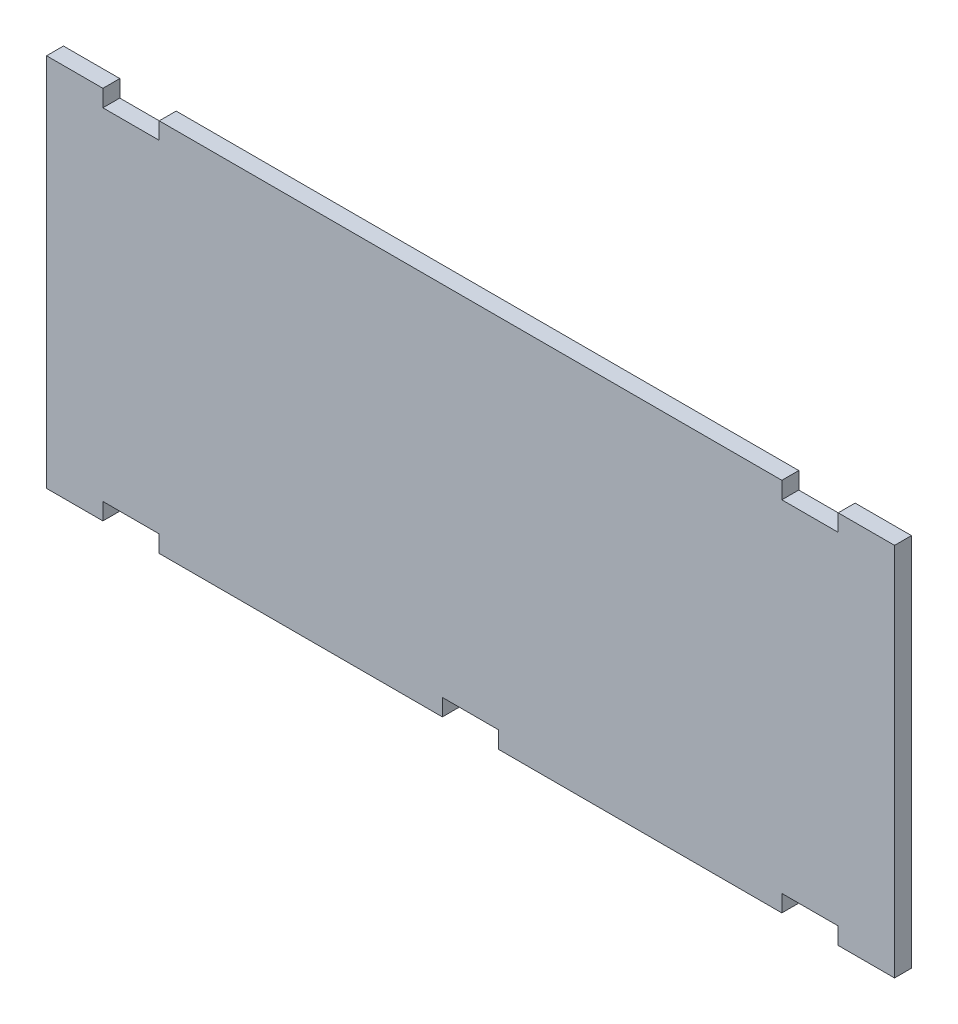
ISO-10303-21;
HEADER;
FILE_DESCRIPTION(('STEP AP214'),'2;1');
FILE_NAME('part.step','',(''),(''),'','','');
FILE_SCHEMA(('AUTOMOTIVE_DESIGN { 1 0 10303 214 1 1 1 1 }'));
ENDSEC;
DATA;
#1=APPLICATION_CONTEXT('core data for automotive mechanical design processes');
#2=APPLICATION_PROTOCOL_DEFINITION('international standard','automotive_design',2000,#1);
#3=PRODUCT_CONTEXT('',#1,'mechanical');
#4=PRODUCT('Part','Part','',(#3));
#5=PRODUCT_RELATED_PRODUCT_CATEGORY('part','',(#4));
#6=PRODUCT_DEFINITION_FORMATION('','',#4);
#7=PRODUCT_DEFINITION_CONTEXT('part definition',#1,'design');
#8=PRODUCT_DEFINITION('design','',#6,#7);
#9=PRODUCT_DEFINITION_SHAPE('','',#8);
#10=(LENGTH_UNIT() NAMED_UNIT(*) SI_UNIT(.MILLI.,.METRE.));
#11=(NAMED_UNIT(*) PLANE_ANGLE_UNIT() SI_UNIT($,.RADIAN.));
#12=(NAMED_UNIT(*) SI_UNIT($,.STERADIAN.) SOLID_ANGLE_UNIT());
#13=UNCERTAINTY_MEASURE_WITH_UNIT(LENGTH_MEASURE(1.E-05),#10,'distance_accuracy_value','');
#14=(GEOMETRIC_REPRESENTATION_CONTEXT(3) GLOBAL_UNCERTAINTY_ASSIGNED_CONTEXT((#13)) GLOBAL_UNIT_ASSIGNED_CONTEXT((#10,
#11,#12)) REPRESENTATION_CONTEXT('',''));
#15=CARTESIAN_POINT('',(0.,0.,0.));
#16=DIRECTION('',(0.,0.,1.));
#17=DIRECTION('',(1.,0.,0.));
#18=AXIS2_PLACEMENT_3D('',#15,#16,#17);
#19=CARTESIAN_POINT('',(0.,0.,6.));
#20=DIRECTION('',(0.,1.,0.));
#21=DIRECTION('',(0.,0.,1.));
#22=AXIS2_PLACEMENT_3D('',#19,#20,#21);
#23=PLANE('',#22);
#24=DIRECTION('',(1.,0.,0.));
#25=VECTOR('',#24,1.);
#26=CARTESIAN_POINT('',(0.,0.,0.));
#27=LINE('',#26,#25);
#28=CARTESIAN_POINT('',(-20.,0.,0.));
#29=VERTEX_POINT('',#28);
#30=CARTESIAN_POINT('',(0.,0.,0.));
#31=VERTEX_POINT('',#30);
#32=EDGE_CURVE('E225',#29,#31,#27,.T.);
#33=ORIENTED_EDGE('',*,*,#32,.T.);
#34=DIRECTION('',(0.,0.,-1.));
#35=VECTOR('',#34,1.);
#36=CARTESIAN_POINT('',(0.,0.,6.));
#37=LINE('',#36,#35);
#38=CARTESIAN_POINT('',(0.,0.,6.));
#39=VERTEX_POINT('',#38);
#40=EDGE_CURVE('E11',#39,#31,#37,.T.);
#41=ORIENTED_EDGE('',*,*,#40,.F.);
#42=DIRECTION('',(1.,0.,0.));
#43=VECTOR('',#42,1.);
#44=CARTESIAN_POINT('',(0.,0.,6.));
#45=LINE('',#44,#43);
#46=CARTESIAN_POINT('',(-20.,0.,6.));
#47=VERTEX_POINT('',#46);
#48=EDGE_CURVE('E271',#47,#39,#45,.T.);
#49=ORIENTED_EDGE('',*,*,#48,.F.);
#50=DIRECTION('',(0.,0.,-1.));
#51=VECTOR('',#50,1.);
#52=CARTESIAN_POINT('',(-20.,0.,6.));
#53=LINE('',#52,#51);
#54=EDGE_CURVE('E221',#47,#29,#53,.T.);
#55=ORIENTED_EDGE('',*,*,#54,.T.);
#56=EDGE_LOOP('',(#33,#41,#49,#55));
#57=FACE_BOUND('',#56,.T.);
#58=ADVANCED_FACE('F33',(#57),#23,.F.);
#59=CARTESIAN_POINT('',(0.,0.,6.));
#60=DIRECTION('',(-1.,0.,0.));
#61=DIRECTION('',(0.,0.,1.));
#62=AXIS2_PLACEMENT_3D('',#59,#60,#61);
#63=PLANE('',#62);
#64=DIRECTION('',(0.,1.,0.));
#65=VECTOR('',#64,1.);
#66=CARTESIAN_POINT('',(0.,0.,0.));
#67=LINE('',#66,#65);
#68=CARTESIAN_POINT('',(0.,133.,0.));
#69=VERTEX_POINT('',#68);
#70=EDGE_CURVE('E228',#31,#69,#67,.T.);
#71=ORIENTED_EDGE('',*,*,#70,.T.);
#72=DIRECTION('',(0.,0.,-1.));
#73=VECTOR('',#72,1.);
#74=CARTESIAN_POINT('',(0.,133.,6.));
#75=LINE('',#74,#73);
#76=CARTESIAN_POINT('',(0.,133.,6.));
#77=VERTEX_POINT('',#76);
#78=EDGE_CURVE('E41',#77,#69,#75,.T.);
#79=ORIENTED_EDGE('',*,*,#78,.F.);
#80=DIRECTION('',(0.,1.,0.));
#81=VECTOR('',#80,1.);
#82=CARTESIAN_POINT('',(0.,0.,6.));
#83=LINE('',#82,#81);
#84=EDGE_CURVE('E140',#39,#77,#83,.T.);
#85=ORIENTED_EDGE('',*,*,#84,.F.);
#86=ORIENTED_EDGE('',*,*,#40,.T.);
#87=EDGE_LOOP('',(#71,#79,#85,#86));
#88=FACE_BOUND('',#87,.T.);
#89=ADVANCED_FACE('F409',(#88),#63,.F.);
#90=CARTESIAN_POINT('',(0.,133.,6.));
#91=DIRECTION('',(0.,-1.,0.));
#92=DIRECTION('',(0.,0.,-1.));
#93=AXIS2_PLACEMENT_3D('',#90,#91,#92);
#94=PLANE('',#93);
#95=DIRECTION('',(-1.,0.,0.));
#96=VECTOR('',#95,1.);
#97=CARTESIAN_POINT('',(0.,133.,0.));
#98=LINE('',#97,#96);
#99=CARTESIAN_POINT('',(-20.,133.,0.));
#100=VERTEX_POINT('',#99);
#101=EDGE_CURVE('E230',#69,#100,#98,.T.);
#102=ORIENTED_EDGE('',*,*,#101,.T.);
#103=DIRECTION('',(0.,0.,-1.));
#104=VECTOR('',#103,1.);
#105=CARTESIAN_POINT('',(-20.,133.,6.));
#106=LINE('',#105,#104);
#107=CARTESIAN_POINT('',(-20.,133.,6.));
#108=VERTEX_POINT('',#107);
#109=EDGE_CURVE('E326',#108,#100,#106,.T.);
#110=ORIENTED_EDGE('',*,*,#109,.F.);
#111=DIRECTION('',(-1.,0.,0.));
#112=VECTOR('',#111,1.);
#113=CARTESIAN_POINT('',(0.,133.,6.));
#114=LINE('',#113,#112);
#115=EDGE_CURVE('E334',#77,#108,#114,.T.);
#116=ORIENTED_EDGE('',*,*,#115,.F.);
#117=ORIENTED_EDGE('',*,*,#78,.T.);
#118=EDGE_LOOP('',(#102,#110,#116,#117));
#119=FACE_BOUND('',#118,.T.);
#120=ADVANCED_FACE('F332',(#119),#94,.F.);
#121=CARTESIAN_POINT('',(-20.,133.,6.));
#122=DIRECTION('',(1.,0.,0.));
#123=DIRECTION('',(0.,0.,-1.));
#124=AXIS2_PLACEMENT_3D('',#121,#122,#123);
#125=PLANE('',#124);
#126=DIRECTION('',(0.,-1.,0.));
#127=VECTOR('',#126,1.);
#128=CARTESIAN_POINT('',(-20.,133.,0.));
#129=LINE('',#128,#127);
#130=CARTESIAN_POINT('',(-20.,127.,0.));
#131=VERTEX_POINT('',#130);
#132=EDGE_CURVE('E232',#100,#131,#129,.T.);
#133=ORIENTED_EDGE('',*,*,#132,.T.);
#134=DIRECTION('',(0.,0.,-1.));
#135=VECTOR('',#134,1.);
#136=CARTESIAN_POINT('',(-20.,127.,6.));
#137=LINE('',#136,#135);
#138=CARTESIAN_POINT('',(-20.,127.,6.));
#139=VERTEX_POINT('',#138);
#140=EDGE_CURVE('E323',#139,#131,#137,.T.);
#141=ORIENTED_EDGE('',*,*,#140,.F.);
#142=DIRECTION('',(0.,-1.,0.));
#143=VECTOR('',#142,1.);
#144=CARTESIAN_POINT('',(-20.,133.,6.));
#145=LINE('',#144,#143);
#146=EDGE_CURVE('E352',#108,#139,#145,.T.);
#147=ORIENTED_EDGE('',*,*,#146,.F.);
#148=ORIENTED_EDGE('',*,*,#109,.T.);
#149=EDGE_LOOP('',(#133,#141,#147,#148));
#150=FACE_BOUND('',#149,.T.);
#151=ADVANCED_FACE('F343',(#150),#125,.F.);
#152=CARTESIAN_POINT('',(-40.,127.,6.));
#153=DIRECTION('',(0.,-1.,0.));
#154=DIRECTION('',(0.,0.,-1.));
#155=AXIS2_PLACEMENT_3D('',#152,#153,#154);
#156=PLANE('',#155);
#157=DIRECTION('',(-1.,0.,0.));
#158=VECTOR('',#157,1.);
#159=CARTESIAN_POINT('',(-40.,127.,0.));
#160=LINE('',#159,#158);
#161=CARTESIAN_POINT('',(-40.,127.,0.));
#162=VERTEX_POINT('',#161);
#163=EDGE_CURVE('E234',#131,#162,#160,.T.);
#164=ORIENTED_EDGE('',*,*,#163,.T.);
#165=DIRECTION('',(0.,0.,-1.));
#166=VECTOR('',#165,1.);
#167=CARTESIAN_POINT('',(-40.,127.,6.));
#168=LINE('',#167,#166);
#169=CARTESIAN_POINT('',(-40.,127.,6.));
#170=VERTEX_POINT('',#169);
#171=EDGE_CURVE('E320',#170,#162,#168,.T.);
#172=ORIENTED_EDGE('',*,*,#171,.F.);
#173=DIRECTION('',(-1.,0.,0.));
#174=VECTOR('',#173,1.);
#175=CARTESIAN_POINT('',(-40.,127.,6.));
#176=LINE('',#175,#174);
#177=EDGE_CURVE('E349',#139,#170,#176,.T.);
#178=ORIENTED_EDGE('',*,*,#177,.F.);
#179=ORIENTED_EDGE('',*,*,#140,.T.);
#180=EDGE_LOOP('',(#164,#172,#178,#179));
#181=FACE_BOUND('',#180,.T.);
#182=ADVANCED_FACE('F347',(#181),#156,.F.);
#183=CARTESIAN_POINT('',(-40.,133.,6.));
#184=DIRECTION('',(-1.,0.,0.));
#185=DIRECTION('',(0.,-1.,0.));
#186=AXIS2_PLACEMENT_3D('',#183,#184,#185);
#187=PLANE('',#186);
#188=DIRECTION('',(0.,1.,0.));
#189=VECTOR('',#188,1.);
#190=CARTESIAN_POINT('',(-40.,133.,0.));
#191=LINE('',#190,#189);
#192=CARTESIAN_POINT('',(-40.,133.,0.));
#193=VERTEX_POINT('',#192);
#194=EDGE_CURVE('E236',#162,#193,#191,.T.);
#195=ORIENTED_EDGE('',*,*,#194,.T.);
#196=DIRECTION('',(0.,0.,-1.));
#197=VECTOR('',#196,1.);
#198=CARTESIAN_POINT('',(-40.,133.,6.));
#199=LINE('',#198,#197);
#200=CARTESIAN_POINT('',(-40.,133.,6.));
#201=VERTEX_POINT('',#200);
#202=EDGE_CURVE('E317',#201,#193,#199,.T.);
#203=ORIENTED_EDGE('',*,*,#202,.F.);
#204=DIRECTION('',(0.,1.,0.));
#205=VECTOR('',#204,1.);
#206=CARTESIAN_POINT('',(-40.,133.,6.));
#207=LINE('',#206,#205);
#208=EDGE_CURVE('E351',#170,#201,#207,.T.);
#209=ORIENTED_EDGE('',*,*,#208,.F.);
#210=ORIENTED_EDGE('',*,*,#171,.T.);
#211=EDGE_LOOP('',(#195,#203,#209,#210));
#212=FACE_BOUND('',#211,.T.);
#213=ADVANCED_FACE('F422',(#212),#187,.F.);
#214=CARTESIAN_POINT('',(-40.,133.,6.));
#215=DIRECTION('',(0.,-1.,0.));
#216=DIRECTION('',(0.,0.,-1.));
#217=AXIS2_PLACEMENT_3D('',#214,#215,#216);
#218=PLANE('',#217);
#219=DIRECTION('',(-1.,0.,0.));
#220=VECTOR('',#219,1.);
#221=CARTESIAN_POINT('',(-40.,133.,0.));
#222=LINE('',#221,#220);
#223=CARTESIAN_POINT('',(-261.,133.,0.));
#224=VERTEX_POINT('',#223);
#225=EDGE_CURVE('E238',#193,#224,#222,.T.);
#226=ORIENTED_EDGE('',*,*,#225,.T.);
#227=DIRECTION('',(0.,0.,-1.));
#228=VECTOR('',#227,1.);
#229=CARTESIAN_POINT('',(-261.,133.,6.));
#230=LINE('',#229,#228);
#231=CARTESIAN_POINT('',(-261.,133.,6.));
#232=VERTEX_POINT('',#231);
#233=EDGE_CURVE('E314',#232,#224,#230,.T.);
#234=ORIENTED_EDGE('',*,*,#233,.F.);
#235=DIRECTION('',(-1.,0.,0.));
#236=VECTOR('',#235,1.);
#237=CARTESIAN_POINT('',(-40.,133.,6.));
#238=LINE('',#237,#236);
#239=EDGE_CURVE('E354',#201,#232,#238,.T.);
#240=ORIENTED_EDGE('',*,*,#239,.F.);
#241=ORIENTED_EDGE('',*,*,#202,.T.);
#242=EDGE_LOOP('',(#226,#234,#240,#241));
#243=FACE_BOUND('',#242,.T.);
#244=ADVANCED_FACE('F425',(#243),#218,.F.);
#245=CARTESIAN_POINT('',(-261.,133.,6.));
#246=DIRECTION('',(1.,0.,0.));
#247=DIRECTION('',(0.,0.,-1.));
#248=AXIS2_PLACEMENT_3D('',#245,#246,#247);
#249=PLANE('',#248);
#250=DIRECTION('',(0.,-1.,0.));
#251=VECTOR('',#250,1.);
#252=CARTESIAN_POINT('',(-261.,133.,0.));
#253=LINE('',#252,#251);
#254=CARTESIAN_POINT('',(-261.,127.,0.));
#255=VERTEX_POINT('',#254);
#256=EDGE_CURVE('E240',#224,#255,#253,.T.);
#257=ORIENTED_EDGE('',*,*,#256,.T.);
#258=DIRECTION('',(0.,0.,-1.));
#259=VECTOR('',#258,1.);
#260=CARTESIAN_POINT('',(-261.,127.,6.));
#261=LINE('',#260,#259);
#262=CARTESIAN_POINT('',(-261.,127.,6.));
#263=VERTEX_POINT('',#262);
#264=EDGE_CURVE('E311',#263,#255,#261,.T.);
#265=ORIENTED_EDGE('',*,*,#264,.F.);
#266=DIRECTION('',(0.,-1.,0.));
#267=VECTOR('',#266,1.);
#268=CARTESIAN_POINT('',(-261.,133.,6.));
#269=LINE('',#268,#267);
#270=EDGE_CURVE('E360',#232,#263,#269,.T.);
#271=ORIENTED_EDGE('',*,*,#270,.F.);
#272=ORIENTED_EDGE('',*,*,#233,.T.);
#273=EDGE_LOOP('',(#257,#265,#271,#272));
#274=FACE_BOUND('',#273,.T.);
#275=ADVANCED_FACE('F429',(#274),#249,.F.);
#276=CARTESIAN_POINT('',(-281.,127.,6.));
#277=DIRECTION('',(0.,-1.,0.));
#278=DIRECTION('',(0.,0.,-1.));
#279=AXIS2_PLACEMENT_3D('',#276,#277,#278);
#280=PLANE('',#279);
#281=DIRECTION('',(-1.,0.,0.));
#282=VECTOR('',#281,1.);
#283=CARTESIAN_POINT('',(-281.,127.,0.));
#284=LINE('',#283,#282);
#285=CARTESIAN_POINT('',(-281.,127.,0.));
#286=VERTEX_POINT('',#285);
#287=EDGE_CURVE('E242',#255,#286,#284,.T.);
#288=ORIENTED_EDGE('',*,*,#287,.T.);
#289=DIRECTION('',(0.,0.,-1.));
#290=VECTOR('',#289,1.);
#291=CARTESIAN_POINT('',(-281.,127.,6.));
#292=LINE('',#291,#290);
#293=CARTESIAN_POINT('',(-281.,127.,6.));
#294=VERTEX_POINT('',#293);
#295=EDGE_CURVE('E308',#294,#286,#292,.T.);
#296=ORIENTED_EDGE('',*,*,#295,.F.);
#297=DIRECTION('',(-1.,0.,0.));
#298=VECTOR('',#297,1.);
#299=CARTESIAN_POINT('',(-281.,127.,6.));
#300=LINE('',#299,#298);
#301=EDGE_CURVE('E362',#263,#294,#300,.T.);
#302=ORIENTED_EDGE('',*,*,#301,.F.);
#303=ORIENTED_EDGE('',*,*,#264,.T.);
#304=EDGE_LOOP('',(#288,#296,#302,#303));
#305=FACE_BOUND('',#304,.T.);
#306=ADVANCED_FACE('F433',(#305),#280,.F.);
#307=CARTESIAN_POINT('',(-281.,133.,6.));
#308=DIRECTION('',(-1.,0.,0.));
#309=DIRECTION('',(0.,0.,1.));
#310=AXIS2_PLACEMENT_3D('',#307,#308,#309);
#311=PLANE('',#310);
#312=DIRECTION('',(0.,1.,0.));
#313=VECTOR('',#312,1.);
#314=CARTESIAN_POINT('',(-281.,133.,0.));
#315=LINE('',#314,#313);
#316=CARTESIAN_POINT('',(-281.,133.,0.));
#317=VERTEX_POINT('',#316);
#318=EDGE_CURVE('E244',#286,#317,#315,.T.);
#319=ORIENTED_EDGE('',*,*,#318,.T.);
#320=DIRECTION('',(0.,0.,-1.));
#321=VECTOR('',#320,1.);
#322=CARTESIAN_POINT('',(-281.,133.,6.));
#323=LINE('',#322,#321);
#324=CARTESIAN_POINT('',(-281.,133.,6.));
#325=VERTEX_POINT('',#324);
#326=EDGE_CURVE('E305',#325,#317,#323,.T.);
#327=ORIENTED_EDGE('',*,*,#326,.F.);
#328=DIRECTION('',(0.,1.,0.));
#329=VECTOR('',#328,1.);
#330=CARTESIAN_POINT('',(-281.,133.,6.));
#331=LINE('',#330,#329);
#332=EDGE_CURVE('E364',#294,#325,#331,.T.);
#333=ORIENTED_EDGE('',*,*,#332,.F.);
#334=ORIENTED_EDGE('',*,*,#295,.T.);
#335=EDGE_LOOP('',(#319,#327,#333,#334));
#336=FACE_BOUND('',#335,.T.);
#337=ADVANCED_FACE('F437',(#336),#311,.F.);
#338=CARTESIAN_POINT('',(-281.,133.,6.));
#339=DIRECTION('',(0.,-1.,0.));
#340=DIRECTION('',(1.,0.,0.));
#341=AXIS2_PLACEMENT_3D('',#338,#339,#340);
#342=PLANE('',#341);
#343=DIRECTION('',(-1.,0.,0.));
#344=VECTOR('',#343,1.);
#345=CARTESIAN_POINT('',(-281.,133.,0.));
#346=LINE('',#345,#344);
#347=CARTESIAN_POINT('',(-301.,133.,0.));
#348=VERTEX_POINT('',#347);
#349=EDGE_CURVE('E246',#317,#348,#346,.T.);
#350=ORIENTED_EDGE('',*,*,#349,.T.);
#351=DIRECTION('',(0.,0.,-1.));
#352=VECTOR('',#351,1.);
#353=CARTESIAN_POINT('',(-301.,133.,6.));
#354=LINE('',#353,#352);
#355=CARTESIAN_POINT('',(-301.,133.,6.));
#356=VERTEX_POINT('',#355);
#357=EDGE_CURVE('E302',#356,#348,#354,.T.);
#358=ORIENTED_EDGE('',*,*,#357,.F.);
#359=DIRECTION('',(-1.,0.,0.));
#360=VECTOR('',#359,1.);
#361=CARTESIAN_POINT('',(-281.,133.,6.));
#362=LINE('',#361,#360);
#363=EDGE_CURVE('E366',#325,#356,#362,.T.);
#364=ORIENTED_EDGE('',*,*,#363,.F.);
#365=ORIENTED_EDGE('',*,*,#326,.T.);
#366=EDGE_LOOP('',(#350,#358,#364,#365));
#367=FACE_BOUND('',#366,.T.);
#368=ADVANCED_FACE('F441',(#367),#342,.F.);
#369=CARTESIAN_POINT('',(-301.,0.,6.));
#370=DIRECTION('',(1.,0.,0.));
#371=DIRECTION('',(0.,0.,-1.));
#372=AXIS2_PLACEMENT_3D('',#369,#370,#371);
#373=PLANE('',#372);
#374=DIRECTION('',(0.,-1.,0.));
#375=VECTOR('',#374,1.);
#376=CARTESIAN_POINT('',(-301.,0.,0.));
#377=LINE('',#376,#375);
#378=CARTESIAN_POINT('',(-301.,0.,0.));
#379=VERTEX_POINT('',#378);
#380=EDGE_CURVE('E248',#348,#379,#377,.T.);
#381=ORIENTED_EDGE('',*,*,#380,.T.);
#382=DIRECTION('',(0.,0.,-1.));
#383=VECTOR('',#382,1.);
#384=CARTESIAN_POINT('',(-301.,0.,6.));
#385=LINE('',#384,#383);
#386=CARTESIAN_POINT('',(-301.,0.,6.));
#387=VERTEX_POINT('',#386);
#388=EDGE_CURVE('E299',#387,#379,#385,.T.);
#389=ORIENTED_EDGE('',*,*,#388,.F.);
#390=DIRECTION('',(0.,-1.,0.));
#391=VECTOR('',#390,1.);
#392=CARTESIAN_POINT('',(-301.,0.,6.));
#393=LINE('',#392,#391);
#394=EDGE_CURVE('E368',#356,#387,#393,.T.);
#395=ORIENTED_EDGE('',*,*,#394,.F.);
#396=ORIENTED_EDGE('',*,*,#357,.T.);
#397=EDGE_LOOP('',(#381,#389,#395,#396));
#398=FACE_BOUND('',#397,.T.);
#399=ADVANCED_FACE('F445',(#398),#373,.F.);
#400=CARTESIAN_POINT('',(-281.,0.,6.));
#401=DIRECTION('',(0.,1.,0.));
#402=DIRECTION('',(-1.,0.,0.));
#403=AXIS2_PLACEMENT_3D('',#400,#401,#402);
#404=PLANE('',#403);
#405=DIRECTION('',(1.,0.,0.));
#406=VECTOR('',#405,1.);
#407=CARTESIAN_POINT('',(-281.,0.,0.));
#408=LINE('',#407,#406);
#409=CARTESIAN_POINT('',(-281.,0.,0.));
#410=VERTEX_POINT('',#409);
#411=EDGE_CURVE('E250',#379,#410,#408,.T.);
#412=ORIENTED_EDGE('',*,*,#411,.T.);
#413=DIRECTION('',(0.,0.,-1.));
#414=VECTOR('',#413,1.);
#415=CARTESIAN_POINT('',(-281.,0.,6.));
#416=LINE('',#415,#414);
#417=CARTESIAN_POINT('',(-281.,0.,6.));
#418=VERTEX_POINT('',#417);
#419=EDGE_CURVE('E296',#418,#410,#416,.T.);
#420=ORIENTED_EDGE('',*,*,#419,.F.);
#421=DIRECTION('',(1.,0.,0.));
#422=VECTOR('',#421,1.);
#423=CARTESIAN_POINT('',(-281.,0.,6.));
#424=LINE('',#423,#422);
#425=EDGE_CURVE('E370',#387,#418,#424,.T.);
#426=ORIENTED_EDGE('',*,*,#425,.F.);
#427=ORIENTED_EDGE('',*,*,#388,.T.);
#428=EDGE_LOOP('',(#412,#420,#426,#427));
#429=FACE_BOUND('',#428,.T.);
#430=ADVANCED_FACE('F449',(#429),#404,.F.);
#431=CARTESIAN_POINT('',(-281.,0.,6.));
#432=DIRECTION('',(-1.,0.,0.));
#433=DIRECTION('',(0.,0.,1.));
#434=AXIS2_PLACEMENT_3D('',#431,#432,#433);
#435=PLANE('',#434);
#436=DIRECTION('',(0.,1.,0.));
#437=VECTOR('',#436,1.);
#438=CARTESIAN_POINT('',(-281.,0.,0.));
#439=LINE('',#438,#437);
#440=CARTESIAN_POINT('',(-281.,6.00000000000003,0.));
#441=VERTEX_POINT('',#440);
#442=EDGE_CURVE('E252',#410,#441,#439,.T.);
#443=ORIENTED_EDGE('',*,*,#442,.T.);
#444=DIRECTION('',(0.,0.,-1.));
#445=VECTOR('',#444,1.);
#446=CARTESIAN_POINT('',(-281.,6.00000000000003,6.));
#447=LINE('',#446,#445);
#448=CARTESIAN_POINT('',(-281.,6.00000000000003,6.));
#449=VERTEX_POINT('',#448);
#450=EDGE_CURVE('E293',#449,#441,#447,.T.);
#451=ORIENTED_EDGE('',*,*,#450,.F.);
#452=DIRECTION('',(0.,1.,0.));
#453=VECTOR('',#452,1.);
#454=CARTESIAN_POINT('',(-281.,0.,6.));
#455=LINE('',#454,#453);
#456=EDGE_CURVE('E372',#418,#449,#455,.T.);
#457=ORIENTED_EDGE('',*,*,#456,.F.);
#458=ORIENTED_EDGE('',*,*,#419,.T.);
#459=EDGE_LOOP('',(#443,#451,#457,#458));
#460=FACE_BOUND('',#459,.T.);
#461=ADVANCED_FACE('F453',(#460),#435,.F.);
#462=CARTESIAN_POINT('',(-281.,6.00000000000003,6.));
#463=DIRECTION('',(0.,1.,0.));
#464=DIRECTION('',(0.,0.,1.));
#465=AXIS2_PLACEMENT_3D('',#462,#463,#464);
#466=PLANE('',#465);
#467=DIRECTION('',(1.,0.,0.));
#468=VECTOR('',#467,1.);
#469=CARTESIAN_POINT('',(-281.,6.00000000000003,0.));
#470=LINE('',#469,#468);
#471=CARTESIAN_POINT('',(-261.,6.00000000000003,0.));
#472=VERTEX_POINT('',#471);
#473=EDGE_CURVE('E254',#441,#472,#470,.T.);
#474=ORIENTED_EDGE('',*,*,#473,.T.);
#475=DIRECTION('',(0.,0.,-1.));
#476=VECTOR('',#475,1.);
#477=CARTESIAN_POINT('',(-261.,6.00000000000003,6.));
#478=LINE('',#477,#476);
#479=CARTESIAN_POINT('',(-261.,6.00000000000003,6.));
#480=VERTEX_POINT('',#479);
#481=EDGE_CURVE('E290',#480,#472,#478,.T.);
#482=ORIENTED_EDGE('',*,*,#481,.F.);
#483=DIRECTION('',(1.,0.,0.));
#484=VECTOR('',#483,1.);
#485=CARTESIAN_POINT('',(-281.,6.00000000000003,6.));
#486=LINE('',#485,#484);
#487=EDGE_CURVE('E374',#449,#480,#486,.T.);
#488=ORIENTED_EDGE('',*,*,#487,.F.);
#489=ORIENTED_EDGE('',*,*,#450,.T.);
#490=EDGE_LOOP('',(#474,#482,#488,#489));
#491=FACE_BOUND('',#490,.T.);
#492=ADVANCED_FACE('F457',(#491),#466,.F.);
#493=CARTESIAN_POINT('',(-261.,0.,6.));
#494=DIRECTION('',(1.,0.,0.));
#495=DIRECTION('',(0.,0.,-1.));
#496=AXIS2_PLACEMENT_3D('',#493,#494,#495);
#497=PLANE('',#496);
#498=DIRECTION('',(0.,-1.,0.));
#499=VECTOR('',#498,1.);
#500=CARTESIAN_POINT('',(-261.,0.,0.));
#501=LINE('',#500,#499);
#502=CARTESIAN_POINT('',(-261.,0.,0.));
#503=VERTEX_POINT('',#502);
#504=EDGE_CURVE('E256',#472,#503,#501,.T.);
#505=ORIENTED_EDGE('',*,*,#504,.T.);
#506=DIRECTION('',(0.,0.,-1.));
#507=VECTOR('',#506,1.);
#508=CARTESIAN_POINT('',(-261.,0.,6.));
#509=LINE('',#508,#507);
#510=CARTESIAN_POINT('',(-261.,0.,6.));
#511=VERTEX_POINT('',#510);
#512=EDGE_CURVE('E287',#511,#503,#509,.T.);
#513=ORIENTED_EDGE('',*,*,#512,.F.);
#514=DIRECTION('',(0.,-1.,0.));
#515=VECTOR('',#514,1.);
#516=CARTESIAN_POINT('',(-261.,0.,6.));
#517=LINE('',#516,#515);
#518=EDGE_CURVE('E376',#480,#511,#517,.T.);
#519=ORIENTED_EDGE('',*,*,#518,.F.);
#520=ORIENTED_EDGE('',*,*,#481,.T.);
#521=EDGE_LOOP('',(#505,#513,#519,#520));
#522=FACE_BOUND('',#521,.T.);
#523=ADVANCED_FACE('F461',(#522),#497,.F.);
#524=CARTESIAN_POINT('',(-160.5,0.,6.));
#525=DIRECTION('',(0.,1.,0.));
#526=DIRECTION('',(-1.,0.,0.));
#527=AXIS2_PLACEMENT_3D('',#524,#525,#526);
#528=PLANE('',#527);
#529=DIRECTION('',(1.,0.,0.));
#530=VECTOR('',#529,1.);
#531=CARTESIAN_POINT('',(-160.5,0.,0.));
#532=LINE('',#531,#530);
#533=CARTESIAN_POINT('',(-160.5,0.,0.));
#534=VERTEX_POINT('',#533);
#535=EDGE_CURVE('E258',#503,#534,#532,.T.);
#536=ORIENTED_EDGE('',*,*,#535,.T.);
#537=DIRECTION('',(0.,0.,-1.));
#538=VECTOR('',#537,1.);
#539=CARTESIAN_POINT('',(-160.5,0.,6.));
#540=LINE('',#539,#538);
#541=CARTESIAN_POINT('',(-160.5,0.,6.));
#542=VERTEX_POINT('',#541);
#543=EDGE_CURVE('E284',#542,#534,#540,.T.);
#544=ORIENTED_EDGE('',*,*,#543,.F.);
#545=DIRECTION('',(1.,0.,0.));
#546=VECTOR('',#545,1.);
#547=CARTESIAN_POINT('',(-160.5,0.,6.));
#548=LINE('',#547,#546);
#549=EDGE_CURVE('E378',#511,#542,#548,.T.);
#550=ORIENTED_EDGE('',*,*,#549,.F.);
#551=ORIENTED_EDGE('',*,*,#512,.T.);
#552=EDGE_LOOP('',(#536,#544,#550,#551));
#553=FACE_BOUND('',#552,.T.);
#554=ADVANCED_FACE('F465',(#553),#528,.F.);
#555=CARTESIAN_POINT('',(-160.5,0.,6.));
#556=DIRECTION('',(-1.,0.,0.));
#557=DIRECTION('',(0.,0.,1.));
#558=AXIS2_PLACEMENT_3D('',#555,#556,#557);
#559=PLANE('',#558);
#560=DIRECTION('',(0.,1.,0.));
#561=VECTOR('',#560,1.);
#562=CARTESIAN_POINT('',(-160.5,0.,0.));
#563=LINE('',#562,#561);
#564=CARTESIAN_POINT('',(-160.5,6.00000000000001,0.));
#565=VERTEX_POINT('',#564);
#566=EDGE_CURVE('E260',#534,#565,#563,.T.);
#567=ORIENTED_EDGE('',*,*,#566,.T.);
#568=DIRECTION('',(0.,0.,-1.));
#569=VECTOR('',#568,1.);
#570=CARTESIAN_POINT('',(-160.5,6.00000000000001,6.));
#571=LINE('',#570,#569);
#572=CARTESIAN_POINT('',(-160.5,6.00000000000001,6.));
#573=VERTEX_POINT('',#572);
#574=EDGE_CURVE('E281',#573,#565,#571,.T.);
#575=ORIENTED_EDGE('',*,*,#574,.F.);
#576=DIRECTION('',(0.,1.,0.));
#577=VECTOR('',#576,1.);
#578=CARTESIAN_POINT('',(-160.5,0.,6.));
#579=LINE('',#578,#577);
#580=EDGE_CURVE('E380',#542,#573,#579,.T.);
#581=ORIENTED_EDGE('',*,*,#580,.F.);
#582=ORIENTED_EDGE('',*,*,#543,.T.);
#583=EDGE_LOOP('',(#567,#575,#581,#582));
#584=FACE_BOUND('',#583,.T.);
#585=ADVANCED_FACE('F469',(#584),#559,.F.);
#586=CARTESIAN_POINT('',(-160.5,6.00000000000001,6.));
#587=DIRECTION('',(0.,1.,0.));
#588=DIRECTION('',(0.,0.,1.));
#589=AXIS2_PLACEMENT_3D('',#586,#587,#588);
#590=PLANE('',#589);
#591=DIRECTION('',(1.,0.,0.));
#592=VECTOR('',#591,1.);
#593=CARTESIAN_POINT('',(-160.5,6.00000000000001,0.));
#594=LINE('',#593,#592);
#595=CARTESIAN_POINT('',(-140.5,6.00000000000001,0.));
#596=VERTEX_POINT('',#595);
#597=EDGE_CURVE('E262',#565,#596,#594,.T.);
#598=ORIENTED_EDGE('',*,*,#597,.T.);
#599=DIRECTION('',(0.,0.,-1.));
#600=VECTOR('',#599,1.);
#601=CARTESIAN_POINT('',(-140.5,6.00000000000001,6.));
#602=LINE('',#601,#600);
#603=CARTESIAN_POINT('',(-140.5,6.00000000000001,6.));
#604=VERTEX_POINT('',#603);
#605=EDGE_CURVE('E278',#604,#596,#602,.T.);
#606=ORIENTED_EDGE('',*,*,#605,.F.);
#607=DIRECTION('',(1.,0.,0.));
#608=VECTOR('',#607,1.);
#609=CARTESIAN_POINT('',(-160.5,6.00000000000001,6.));
#610=LINE('',#609,#608);
#611=EDGE_CURVE('E382',#573,#604,#610,.T.);
#612=ORIENTED_EDGE('',*,*,#611,.F.);
#613=ORIENTED_EDGE('',*,*,#574,.T.);
#614=EDGE_LOOP('',(#598,#606,#612,#613));
#615=FACE_BOUND('',#614,.T.);
#616=ADVANCED_FACE('F473',(#615),#590,.F.);
#617=CARTESIAN_POINT('',(-140.5,0.,6.));
#618=DIRECTION('',(1.,0.,0.));
#619=DIRECTION('',(0.,0.,-1.));
#620=AXIS2_PLACEMENT_3D('',#617,#618,#619);
#621=PLANE('',#620);
#622=DIRECTION('',(0.,-1.,0.));
#623=VECTOR('',#622,1.);
#624=CARTESIAN_POINT('',(-140.5,0.,0.));
#625=LINE('',#624,#623);
#626=CARTESIAN_POINT('',(-140.5,0.,0.));
#627=VERTEX_POINT('',#626);
#628=EDGE_CURVE('E264',#596,#627,#625,.T.);
#629=ORIENTED_EDGE('',*,*,#628,.T.);
#630=DIRECTION('',(0.,0.,-1.));
#631=VECTOR('',#630,1.);
#632=CARTESIAN_POINT('',(-140.5,0.,6.));
#633=LINE('',#632,#631);
#634=CARTESIAN_POINT('',(-140.5,0.,6.));
#635=VERTEX_POINT('',#634);
#636=EDGE_CURVE('E275',#635,#627,#633,.T.);
#637=ORIENTED_EDGE('',*,*,#636,.F.);
#638=DIRECTION('',(0.,-1.,0.));
#639=VECTOR('',#638,1.);
#640=CARTESIAN_POINT('',(-140.5,0.,6.));
#641=LINE('',#640,#639);
#642=EDGE_CURVE('E384',#604,#635,#641,.T.);
#643=ORIENTED_EDGE('',*,*,#642,.F.);
#644=ORIENTED_EDGE('',*,*,#605,.T.);
#645=EDGE_LOOP('',(#629,#637,#643,#644));
#646=FACE_BOUND('',#645,.T.);
#647=ADVANCED_FACE('F390',(#646),#621,.F.);
#648=CARTESIAN_POINT('',(-40.,0.,6.));
#649=DIRECTION('',(0.,1.,0.));
#650=DIRECTION('',(-1.,0.,0.));
#651=AXIS2_PLACEMENT_3D('',#648,#649,#650);
#652=PLANE('',#651);
#653=DIRECTION('',(1.,0.,0.));
#654=VECTOR('',#653,1.);
#655=CARTESIAN_POINT('',(-40.,0.,0.));
#656=LINE('',#655,#654);
#657=CARTESIAN_POINT('',(-40.,0.,0.));
#658=VERTEX_POINT('',#657);
#659=EDGE_CURVE('E266',#627,#658,#656,.T.);
#660=ORIENTED_EDGE('',*,*,#659,.T.);
#661=DIRECTION('',(0.,0.,-1.));
#662=VECTOR('',#661,1.);
#663=CARTESIAN_POINT('',(-40.,0.,6.));
#664=LINE('',#663,#662);
#665=CARTESIAN_POINT('',(-40.,0.,6.));
#666=VERTEX_POINT('',#665);
#667=EDGE_CURVE('E216',#666,#658,#664,.T.);
#668=ORIENTED_EDGE('',*,*,#667,.F.);
#669=DIRECTION('',(1.,0.,0.));
#670=VECTOR('',#669,1.);
#671=CARTESIAN_POINT('',(-40.,0.,6.));
#672=LINE('',#671,#670);
#673=EDGE_CURVE('E207',#635,#666,#672,.T.);
#674=ORIENTED_EDGE('',*,*,#673,.F.);
#675=ORIENTED_EDGE('',*,*,#636,.T.);
#676=EDGE_LOOP('',(#660,#668,#674,#675));
#677=FACE_BOUND('',#676,.T.);
#678=ADVANCED_FACE('F394',(#677),#652,.F.);
#679=CARTESIAN_POINT('',(-40.,0.,6.));
#680=DIRECTION('',(-1.,0.,0.));
#681=DIRECTION('',(0.,-1.,0.));
#682=AXIS2_PLACEMENT_3D('',#679,#680,#681);
#683=PLANE('',#682);
#684=DIRECTION('',(0.,1.,0.));
#685=VECTOR('',#684,1.);
#686=CARTESIAN_POINT('',(-40.,0.,0.));
#687=LINE('',#686,#685);
#688=CARTESIAN_POINT('',(-40.,6.00000000000001,0.));
#689=VERTEX_POINT('',#688);
#690=EDGE_CURVE('E215',#658,#689,#687,.T.);
#691=ORIENTED_EDGE('',*,*,#690,.T.);
#692=DIRECTION('',(0.,0.,-1.));
#693=VECTOR('',#692,1.);
#694=CARTESIAN_POINT('',(-40.,6.00000000000001,6.));
#695=LINE('',#694,#693);
#696=CARTESIAN_POINT('',(-40.,6.00000000000001,6.));
#697=VERTEX_POINT('',#696);
#698=EDGE_CURVE('E212',#697,#689,#695,.T.);
#699=ORIENTED_EDGE('',*,*,#698,.F.);
#700=DIRECTION('',(0.,1.,0.));
#701=VECTOR('',#700,1.);
#702=CARTESIAN_POINT('',(-40.,0.,6.));
#703=LINE('',#702,#701);
#704=EDGE_CURVE('E201',#666,#697,#703,.T.);
#705=ORIENTED_EDGE('',*,*,#704,.F.);
#706=ORIENTED_EDGE('',*,*,#667,.T.);
#707=EDGE_LOOP('',(#691,#699,#705,#706));
#708=FACE_BOUND('',#707,.T.);
#709=ADVANCED_FACE('F213',(#708),#683,.F.);
#710=CARTESIAN_POINT('',(-40.,6.00000000000001,6.));
#711=DIRECTION('',(0.,1.,0.));
#712=DIRECTION('',(0.,0.,1.));
#713=AXIS2_PLACEMENT_3D('',#710,#711,#712);
#714=PLANE('',#713);
#715=DIRECTION('',(1.,0.,0.));
#716=VECTOR('',#715,1.);
#717=CARTESIAN_POINT('',(-40.,6.00000000000001,0.));
#718=LINE('',#717,#716);
#719=CARTESIAN_POINT('',(-20.,6.00000000000001,0.));
#720=VERTEX_POINT('',#719);
#721=EDGE_CURVE('E126',#689,#720,#718,.T.);
#722=ORIENTED_EDGE('',*,*,#721,.T.);
#723=DIRECTION('',(0.,0.,-1.));
#724=VECTOR('',#723,1.);
#725=CARTESIAN_POINT('',(-20.,6.00000000000001,6.));
#726=LINE('',#725,#724);
#727=CARTESIAN_POINT('',(-20.,6.00000000000001,6.));
#728=VERTEX_POINT('',#727);
#729=EDGE_CURVE('E217',#728,#720,#726,.T.);
#730=ORIENTED_EDGE('',*,*,#729,.F.);
#731=DIRECTION('',(1.,0.,0.));
#732=VECTOR('',#731,1.);
#733=CARTESIAN_POINT('',(-40.,6.00000000000001,6.));
#734=LINE('',#733,#732);
#735=EDGE_CURVE('E205',#697,#728,#734,.T.);
#736=ORIENTED_EDGE('',*,*,#735,.F.);
#737=ORIENTED_EDGE('',*,*,#698,.T.);
#738=EDGE_LOOP('',(#722,#730,#736,#737));
#739=FACE_BOUND('',#738,.T.);
#740=ADVANCED_FACE('F219',(#739),#714,.F.);
#741=CARTESIAN_POINT('',(-20.,0.,6.));
#742=DIRECTION('',(1.,0.,0.));
#743=DIRECTION('',(0.,0.,-1.));
#744=AXIS2_PLACEMENT_3D('',#741,#742,#743);
#745=PLANE('',#744);
#746=DIRECTION('',(0.,-1.,0.));
#747=VECTOR('',#746,1.);
#748=CARTESIAN_POINT('',(-20.,0.,0.));
#749=LINE('',#748,#747);
#750=EDGE_CURVE('E132',#720,#29,#749,.T.);
#751=ORIENTED_EDGE('',*,*,#750,.T.);
#752=ORIENTED_EDGE('',*,*,#54,.F.);
#753=DIRECTION('',(0.,-1.,0.));
#754=VECTOR('',#753,1.);
#755=CARTESIAN_POINT('',(-20.,0.,6.));
#756=LINE('',#755,#754);
#757=EDGE_CURVE('E49',#728,#47,#756,.T.);
#758=ORIENTED_EDGE('',*,*,#757,.F.);
#759=ORIENTED_EDGE('',*,*,#729,.T.);
#760=EDGE_LOOP('',(#751,#752,#758,#759));
#761=FACE_BOUND('',#760,.T.);
#762=ADVANCED_FACE('F398',(#761),#745,.F.);
#763=CARTESIAN_POINT('',(0.,0.,6.));
#764=DIRECTION('',(0.,0.,-1.));
#765=DIRECTION('',(-1.,0.,0.));
#766=AXIS2_PLACEMENT_3D('',#763,#764,#765);
#767=PLANE('',#766);
#768=ORIENTED_EDGE('',*,*,#48,.T.);
#769=ORIENTED_EDGE('',*,*,#84,.T.);
#770=ORIENTED_EDGE('',*,*,#115,.T.);
#771=ORIENTED_EDGE('',*,*,#146,.T.);
#772=ORIENTED_EDGE('',*,*,#177,.T.);
#773=ORIENTED_EDGE('',*,*,#208,.T.);
#774=ORIENTED_EDGE('',*,*,#239,.T.);
#775=ORIENTED_EDGE('',*,*,#270,.T.);
#776=ORIENTED_EDGE('',*,*,#301,.T.);
#777=ORIENTED_EDGE('',*,*,#332,.T.);
#778=ORIENTED_EDGE('',*,*,#363,.T.);
#779=ORIENTED_EDGE('',*,*,#394,.T.);
#780=ORIENTED_EDGE('',*,*,#425,.T.);
#781=ORIENTED_EDGE('',*,*,#456,.T.);
#782=ORIENTED_EDGE('',*,*,#487,.T.);
#783=ORIENTED_EDGE('',*,*,#518,.T.);
#784=ORIENTED_EDGE('',*,*,#549,.T.);
#785=ORIENTED_EDGE('',*,*,#580,.T.);
#786=ORIENTED_EDGE('',*,*,#611,.T.);
#787=ORIENTED_EDGE('',*,*,#642,.T.);
#788=ORIENTED_EDGE('',*,*,#673,.T.);
#789=ORIENTED_EDGE('',*,*,#704,.T.);
#790=ORIENTED_EDGE('',*,*,#735,.T.);
#791=ORIENTED_EDGE('',*,*,#757,.T.);
#792=EDGE_LOOP('',(#768,#769,#770,#771,#772,#773,#774,#775,#776,#777,#778,#779,#780,#781,#782,
#783,#784,#785,#786,#787,#788,#789,#790,#791));
#793=FACE_BOUND('',#792,.T.);
#794=ADVANCED_FACE('F203',(#793),#767,.F.);
#795=CARTESIAN_POINT('',(0.,0.,0.));
#796=DIRECTION('',(0.,0.,-1.));
#797=DIRECTION('',(-1.,0.,0.));
#798=AXIS2_PLACEMENT_3D('',#795,#796,#797);
#799=PLANE('',#798);
#800=ORIENTED_EDGE('',*,*,#32,.F.);
#801=ORIENTED_EDGE('',*,*,#750,.F.);
#802=ORIENTED_EDGE('',*,*,#721,.F.);
#803=ORIENTED_EDGE('',*,*,#690,.F.);
#804=ORIENTED_EDGE('',*,*,#659,.F.);
#805=ORIENTED_EDGE('',*,*,#628,.F.);
#806=ORIENTED_EDGE('',*,*,#597,.F.);
#807=ORIENTED_EDGE('',*,*,#566,.F.);
#808=ORIENTED_EDGE('',*,*,#535,.F.);
#809=ORIENTED_EDGE('',*,*,#504,.F.);
#810=ORIENTED_EDGE('',*,*,#473,.F.);
#811=ORIENTED_EDGE('',*,*,#442,.F.);
#812=ORIENTED_EDGE('',*,*,#411,.F.);
#813=ORIENTED_EDGE('',*,*,#380,.F.);
#814=ORIENTED_EDGE('',*,*,#349,.F.);
#815=ORIENTED_EDGE('',*,*,#318,.F.);
#816=ORIENTED_EDGE('',*,*,#287,.F.);
#817=ORIENTED_EDGE('',*,*,#256,.F.);
#818=ORIENTED_EDGE('',*,*,#225,.F.);
#819=ORIENTED_EDGE('',*,*,#194,.F.);
#820=ORIENTED_EDGE('',*,*,#163,.F.);
#821=ORIENTED_EDGE('',*,*,#132,.F.);
#822=ORIENTED_EDGE('',*,*,#101,.F.);
#823=ORIENTED_EDGE('',*,*,#70,.F.);
#824=EDGE_LOOP('',(#800,#801,#802,#803,#804,#805,#806,#807,#808,#809,#810,#811,#812,#813,#814,
#815,#816,#817,#818,#819,#820,#821,#822,#823));
#825=FACE_BOUND('',#824,.T.);
#826=ADVANCED_FACE('F338',(#825),#799,.T.);
#827=CLOSED_SHELL('',(#58,#89,#120,#151,#182,#213,#244,#275,#306,#337,#368,#399,#430,#461,#492,
#523,#554,#585,#616,#647,#678,#709,#740,#762,#794,#826));
#828=MANIFOLD_SOLID_BREP('B2',#827);
#829=ADVANCED_BREP_SHAPE_REPRESENTATION('',(#18,#828),#14);
#830=SHAPE_DEFINITION_REPRESENTATION(#9,#829);
ENDSEC;
END-ISO-10303-21;
